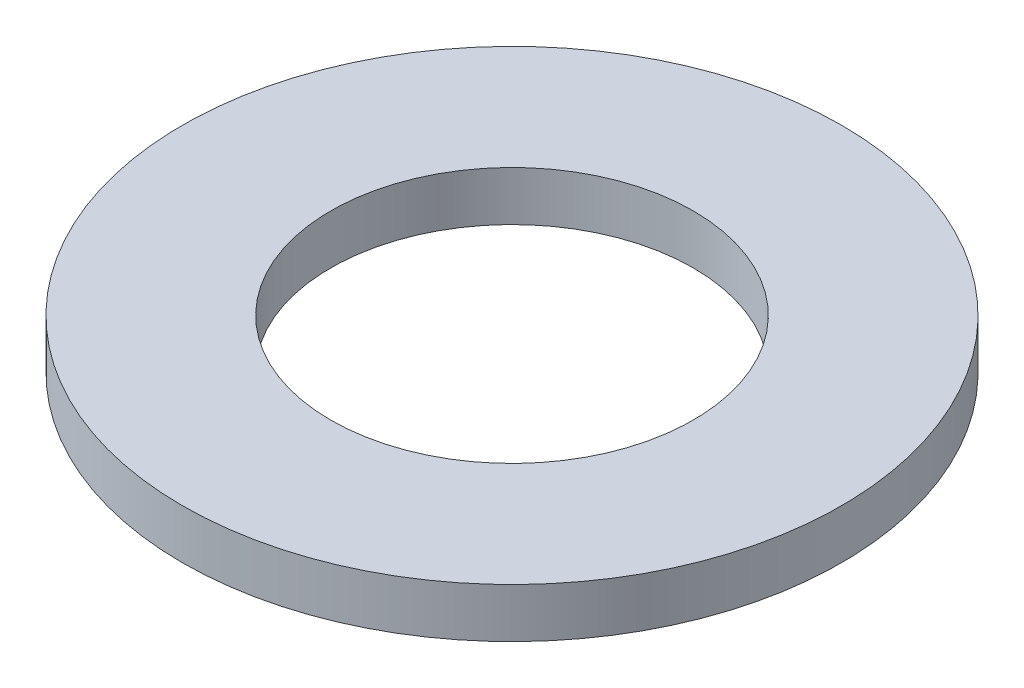
ISO-10303-21;
HEADER;
FILE_DESCRIPTION(('STEP AP214'),'2;1');
FILE_NAME('part.step','',(''),(''),'','','');
FILE_SCHEMA(('AUTOMOTIVE_DESIGN { 1 0 10303 214 1 1 1 1 }'));
ENDSEC;
DATA;
#1=APPLICATION_CONTEXT('core data for automotive mechanical design processes');
#2=APPLICATION_PROTOCOL_DEFINITION('international standard','automotive_design',2000,#1);
#3=PRODUCT_CONTEXT('',#1,'mechanical');
#4=PRODUCT('Part','Part','',(#3));
#5=PRODUCT_RELATED_PRODUCT_CATEGORY('part','',(#4));
#6=PRODUCT_DEFINITION_FORMATION('','',#4);
#7=PRODUCT_DEFINITION_CONTEXT('part definition',#1,'design');
#8=PRODUCT_DEFINITION('design','',#6,#7);
#9=PRODUCT_DEFINITION_SHAPE('','',#8);
#10=(LENGTH_UNIT() NAMED_UNIT(*) SI_UNIT(.MILLI.,.METRE.));
#11=(NAMED_UNIT(*) PLANE_ANGLE_UNIT() SI_UNIT($,.RADIAN.));
#12=(NAMED_UNIT(*) SI_UNIT($,.STERADIAN.) SOLID_ANGLE_UNIT());
#13=UNCERTAINTY_MEASURE_WITH_UNIT(LENGTH_MEASURE(1.E-05),#10,'distance_accuracy_value','');
#14=(GEOMETRIC_REPRESENTATION_CONTEXT(3) GLOBAL_UNCERTAINTY_ASSIGNED_CONTEXT((#13)) GLOBAL_UNIT_ASSIGNED_CONTEXT((#10,
#11,#12)) REPRESENTATION_CONTEXT('',''));
#15=CARTESIAN_POINT('',(0.,0.,0.));
#16=DIRECTION('',(0.,0.,1.));
#17=DIRECTION('',(1.,0.,0.));
#18=AXIS2_PLACEMENT_3D('',#15,#16,#17);
#19=CARTESIAN_POINT('',(0.,0.,0.));
#20=DIRECTION('',(0.,1.,0.));
#21=DIRECTION('',(0.,0.,1.));
#22=AXIS2_PLACEMENT_3D('',#19,#20,#21);
#23=PLANE('',#22);
#24=CARTESIAN_POINT('',(0.,0.,0.));
#25=DIRECTION('',(0.,1.,0.));
#26=DIRECTION('',(0.,0.,1.));
#27=AXIS2_PLACEMENT_3D('',#24,#25,#26);
#28=CIRCLE('',#27,5.);
#29=CARTESIAN_POINT('',(0.,0.,5.));
#30=VERTEX_POINT('',#29);
#31=EDGE_CURVE('E27',#30,#30,#28,.T.);
#32=ORIENTED_EDGE('',*,*,#31,.F.);
#33=EDGE_LOOP('',(#32));
#34=FACE_BOUND('',#33,.T.);
#35=CARTESIAN_POINT('',(0.,0.,0.));
#36=DIRECTION('',(0.,1.,0.));
#37=DIRECTION('',(0.,0.,1.));
#38=AXIS2_PLACEMENT_3D('',#35,#36,#37);
#39=CIRCLE('',#38,2.75);
#40=CARTESIAN_POINT('',(0.,0.,2.75));
#41=VERTEX_POINT('',#40);
#42=EDGE_CURVE('E18',#41,#41,#39,.T.);
#43=ORIENTED_EDGE('',*,*,#42,.T.);
#44=EDGE_LOOP('',(#43));
#45=FACE_BOUND('',#44,.T.);
#46=ADVANCED_FACE('F15',(#34,#45),#23,.F.);
#47=CARTESIAN_POINT('',(0.,0.,0.));
#48=DIRECTION('',(0.,1.,0.));
#49=DIRECTION('',(0.,0.,1.));
#50=AXIS2_PLACEMENT_3D('',#47,#48,#49);
#51=CYLINDRICAL_SURFACE('',#50,2.75);
#52=ORIENTED_EDGE('',*,*,#42,.F.);
#53=EDGE_LOOP('',(#52));
#54=FACE_BOUND('',#53,.T.);
#55=CARTESIAN_POINT('',(0.,0.75,0.));
#56=DIRECTION('',(0.,1.,0.));
#57=DIRECTION('',(0.,0.,1.));
#58=AXIS2_PLACEMENT_3D('',#55,#56,#57);
#59=CIRCLE('',#58,2.75);
#60=CARTESIAN_POINT('',(0.,0.75,2.75));
#61=VERTEX_POINT('',#60);
#62=EDGE_CURVE('E22',#61,#61,#59,.F.);
#63=ORIENTED_EDGE('',*,*,#62,.F.);
#64=EDGE_LOOP('',(#63));
#65=FACE_BOUND('',#64,.T.);
#66=ADVANCED_FACE('F36',(#54,#65),#51,.F.);
#67=CARTESIAN_POINT('',(0.,0.,0.));
#68=DIRECTION('',(0.,1.,0.));
#69=DIRECTION('',(0.,0.,1.));
#70=AXIS2_PLACEMENT_3D('',#67,#68,#69);
#71=CYLINDRICAL_SURFACE('',#70,5.);
#72=ORIENTED_EDGE('',*,*,#31,.T.);
#73=EDGE_LOOP('',(#72));
#74=FACE_BOUND('',#73,.T.);
#75=CARTESIAN_POINT('',(0.,0.75,0.));
#76=DIRECTION('',(0.,1.,0.));
#77=DIRECTION('',(0.,0.,1.));
#78=AXIS2_PLACEMENT_3D('',#75,#76,#77);
#79=CIRCLE('',#78,5.);
#80=CARTESIAN_POINT('',(0.,0.75,5.));
#81=VERTEX_POINT('',#80);
#82=EDGE_CURVE('E10',#81,#81,#79,.T.);
#83=ORIENTED_EDGE('',*,*,#82,.F.);
#84=EDGE_LOOP('',(#83));
#85=FACE_BOUND('',#84,.T.);
#86=ADVANCED_FACE('F39',(#74,#85),#71,.T.);
#87=CARTESIAN_POINT('',(0.,0.75,0.));
#88=DIRECTION('',(0.,1.,0.));
#89=DIRECTION('',(0.,0.,1.));
#90=AXIS2_PLACEMENT_3D('',#87,#88,#89);
#91=PLANE('',#90);
#92=ORIENTED_EDGE('',*,*,#82,.T.);
#93=EDGE_LOOP('',(#92));
#94=FACE_BOUND('',#93,.T.);
#95=ORIENTED_EDGE('',*,*,#62,.T.);
#96=EDGE_LOOP('',(#95));
#97=FACE_BOUND('',#96,.T.);
#98=ADVANCED_FACE('F42',(#94,#97),#91,.T.);
#99=CLOSED_SHELL('',(#46,#66,#86,#98));
#100=MANIFOLD_SOLID_BREP('B1',#99);
#101=ADVANCED_BREP_SHAPE_REPRESENTATION('',(#18,#100),#14);
#102=SHAPE_DEFINITION_REPRESENTATION(#9,#101);
ENDSEC;
END-ISO-10303-21;
